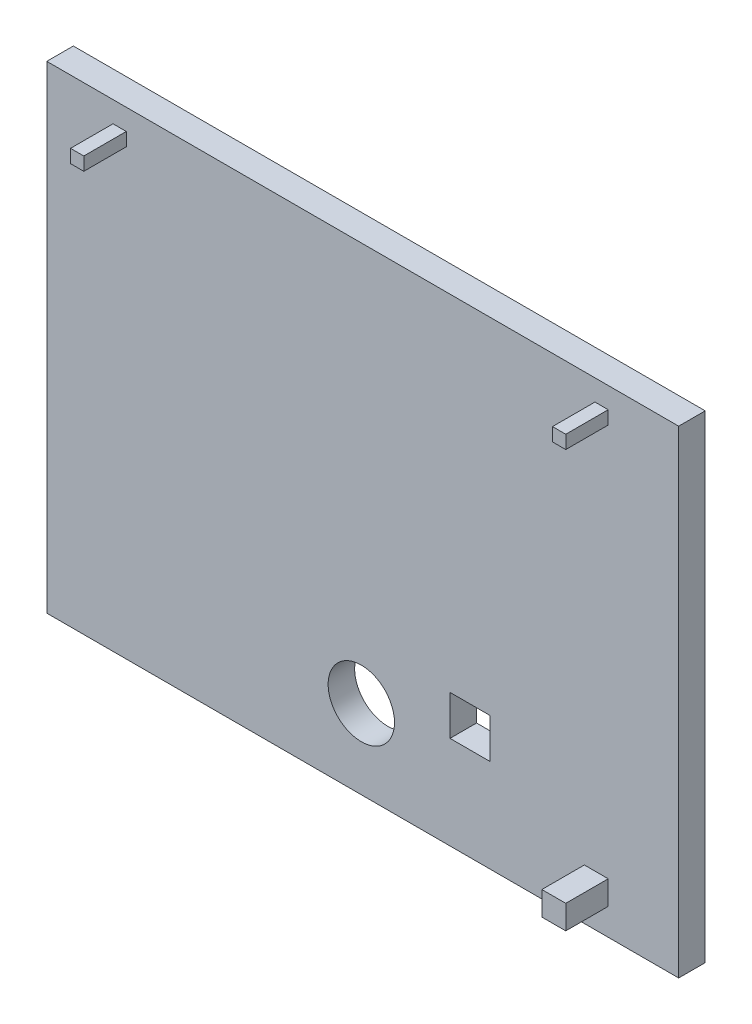
ISO-10303-21;
HEADER;
FILE_DESCRIPTION(('STEP AP214'),'2;1');
FILE_NAME('part.step','',(''),(''),'','','');
FILE_SCHEMA(('AUTOMOTIVE_DESIGN { 1 0 10303 214 1 1 1 1 }'));
ENDSEC;
DATA;
#1=APPLICATION_CONTEXT('core data for automotive mechanical design processes');
#2=APPLICATION_PROTOCOL_DEFINITION('international standard','automotive_design',2000,#1);
#3=PRODUCT_CONTEXT('',#1,'mechanical');
#4=PRODUCT('Part','Part','',(#3));
#5=PRODUCT_RELATED_PRODUCT_CATEGORY('part','',(#4));
#6=PRODUCT_DEFINITION_FORMATION('','',#4);
#7=PRODUCT_DEFINITION_CONTEXT('part definition',#1,'design');
#8=PRODUCT_DEFINITION('design','',#6,#7);
#9=PRODUCT_DEFINITION_SHAPE('','',#8);
#10=(LENGTH_UNIT() NAMED_UNIT(*) SI_UNIT(.MILLI.,.METRE.));
#11=(NAMED_UNIT(*) PLANE_ANGLE_UNIT() SI_UNIT($,.RADIAN.));
#12=(NAMED_UNIT(*) SI_UNIT($,.STERADIAN.) SOLID_ANGLE_UNIT());
#13=UNCERTAINTY_MEASURE_WITH_UNIT(LENGTH_MEASURE(1.E-05),#10,'distance_accuracy_value','');
#14=(GEOMETRIC_REPRESENTATION_CONTEXT(3) GLOBAL_UNCERTAINTY_ASSIGNED_CONTEXT((#13)) GLOBAL_UNIT_ASSIGNED_CONTEXT((#10,
#11,#12)) REPRESENTATION_CONTEXT('',''));
#15=CARTESIAN_POINT('',(0.,0.,0.));
#16=DIRECTION('',(0.,0.,1.));
#17=DIRECTION('',(1.,0.,0.));
#18=AXIS2_PLACEMENT_3D('',#15,#16,#17);
#19=CARTESIAN_POINT('',(0.,0.,5.));
#20=DIRECTION('',(0.,0.,1.));
#21=DIRECTION('',(1.,0.,0.));
#22=AXIS2_PLACEMENT_3D('',#19,#20,#21);
#23=PLANE('',#22);
#24=DIRECTION('',(0.,-1.,0.));
#25=VECTOR('',#24,1.);
#26=CARTESIAN_POINT('',(75.9499050291584,-2.34225925781849E-13,5.));
#27=LINE('',#26,#25);
#28=CARTESIAN_POINT('',(75.949905029158,-119.032846691838,5.));
#29=VERTEX_POINT('',#28);
#30=CARTESIAN_POINT('',(75.949905029158,-123.532846691838,5.));
#31=VERTEX_POINT('',#30);
#32=EDGE_CURVE('E348',#29,#31,#27,.T.);
#33=ORIENTED_EDGE('',*,*,#32,.F.);
#34=DIRECTION('',(1.,0.,0.));
#35=VECTOR('',#34,1.);
#36=CARTESIAN_POINT('',(0.,-119.032846691838,5.));
#37=LINE('',#36,#35);
#38=CARTESIAN_POINT('',(80.4499050291581,-119.032846691838,5.));
#39=VERTEX_POINT('',#38);
#40=EDGE_CURVE('E333',#29,#39,#37,.T.);
#41=ORIENTED_EDGE('',*,*,#40,.T.);
#42=DIRECTION('',(0.,-1.,0.));
#43=VECTOR('',#42,1.);
#44=CARTESIAN_POINT('',(80.4499050291581,0.,5.));
#45=LINE('',#44,#43);
#46=CARTESIAN_POINT('',(80.4499050291581,-123.532846691838,5.));
#47=VERTEX_POINT('',#46);
#48=EDGE_CURVE('E343',#39,#47,#45,.T.);
#49=ORIENTED_EDGE('',*,*,#48,.T.);
#50=DIRECTION('',(1.,0.,0.));
#51=VECTOR('',#50,1.);
#52=CARTESIAN_POINT('',(0.,-123.532846691838,5.));
#53=LINE('',#52,#51);
#54=EDGE_CURVE('E346',#31,#47,#53,.T.);
#55=ORIENTED_EDGE('',*,*,#54,.F.);
#56=EDGE_LOOP('',(#33,#41,#49,#55));
#57=FACE_BOUND('',#56,.T.);
#58=CARTESIAN_POINT('',(33.949905029158,-113.682846691838,5.));
#59=DIRECTION('',(0.,0.,1.));
#60=DIRECTION('',(1.,0.,0.));
#61=AXIS2_PLACEMENT_3D('',#58,#59,#60);
#62=CIRCLE('',#61,6.25000000000001);
#63=CARTESIAN_POINT('',(40.199905029158,-113.682846691838,5.));
#64=VERTEX_POINT('',#63);
#65=EDGE_CURVE('E271',#64,#64,#62,.T.);
#66=ORIENTED_EDGE('',*,*,#65,.F.);
#67=EDGE_LOOP('',(#66));
#68=FACE_BOUND('',#67,.T.);
#69=DIRECTION('',(1.,0.,0.));
#70=VECTOR('',#69,1.);
#71=CARTESIAN_POINT('',(0.,-103.532846691838,5.));
#72=LINE('',#71,#70);
#73=CARTESIAN_POINT('',(50.649905029158,-103.532846691838,5.));
#74=VERTEX_POINT('',#73);
#75=CARTESIAN_POINT('',(58.149905029158,-103.532846691838,5.));
#76=VERTEX_POINT('',#75);
#77=EDGE_CURVE('E274',#74,#76,#72,.T.);
#78=ORIENTED_EDGE('',*,*,#77,.T.);
#79=DIRECTION('',(0.,-1.,0.));
#80=VECTOR('',#79,1.);
#81=CARTESIAN_POINT('',(58.149905029158,0.,5.));
#82=LINE('',#81,#80);
#83=CARTESIAN_POINT('',(58.149905029158,-111.032846691838,5.));
#84=VERTEX_POINT('',#83);
#85=EDGE_CURVE('E278',#76,#84,#82,.T.);
#86=ORIENTED_EDGE('',*,*,#85,.T.);
#87=DIRECTION('',(1.,0.,0.));
#88=VECTOR('',#87,1.);
#89=CARTESIAN_POINT('',(0.,-111.032846691838,5.));
#90=LINE('',#89,#88);
#91=CARTESIAN_POINT('',(50.649905029158,-111.032846691838,5.));
#92=VERTEX_POINT('',#91);
#93=EDGE_CURVE('E280',#92,#84,#90,.T.);
#94=ORIENTED_EDGE('',*,*,#93,.F.);
#95=DIRECTION('',(0.,-1.,0.));
#96=VECTOR('',#95,1.);
#97=CARTESIAN_POINT('',(50.649905029158,0.,5.));
#98=LINE('',#97,#96);
#99=EDGE_CURVE('E283',#74,#92,#98,.T.);
#100=ORIENTED_EDGE('',*,*,#99,.F.);
#101=EDGE_LOOP('',(#78,#86,#94,#100));
#102=FACE_BOUND('',#101,.T.);
#103=DIRECTION('',(0.,-1.,0.));
#104=VECTOR('',#103,1.);
#105=CARTESIAN_POINT('',(93.714905029158,0.,5.));
#106=LINE('',#105,#104);
#107=CARTESIAN_POINT('',(93.714905029158,-38.5828466918378,5.));
#108=VERTEX_POINT('',#107);
#109=CARTESIAN_POINT('',(93.714905029158,-128.582846691838,5.));
#110=VERTEX_POINT('',#109);
#111=EDGE_CURVE('E286',#108,#110,#106,.T.);
#112=ORIENTED_EDGE('',*,*,#111,.F.);
#113=DIRECTION('',(1.,0.,0.));
#114=VECTOR('',#113,1.);
#115=CARTESIAN_POINT('',(0.,-38.5828466918377,5.));
#116=LINE('',#115,#114);
#117=CARTESIAN_POINT('',(-25.285094970842,-38.5828466918377,5.));
#118=VERTEX_POINT('',#117);
#119=EDGE_CURVE('E289',#118,#108,#116,.T.);
#120=ORIENTED_EDGE('',*,*,#119,.F.);
#121=DIRECTION('',(0.,-1.,0.));
#122=VECTOR('',#121,1.);
#123=CARTESIAN_POINT('',(-25.285094970842,0.,5.));
#124=LINE('',#123,#122);
#125=CARTESIAN_POINT('',(-25.2850949708419,-128.582846691838,5.));
#126=VERTEX_POINT('',#125);
#127=EDGE_CURVE('E292',#118,#126,#124,.T.);
#128=ORIENTED_EDGE('',*,*,#127,.T.);
#129=DIRECTION('',(1.,0.,0.));
#130=VECTOR('',#129,1.);
#131=CARTESIAN_POINT('',(0.,-128.582846691838,5.));
#132=LINE('',#131,#130);
#133=EDGE_CURVE('E295',#126,#110,#132,.T.);
#134=ORIENTED_EDGE('',*,*,#133,.T.);
#135=EDGE_LOOP('',(#112,#120,#128,#134));
#136=FACE_BOUND('',#135,.T.);
#137=DIRECTION('',(-1.,0.,0.));
#138=VECTOR('',#137,1.);
#139=CARTESIAN_POINT('',(0.,-45.0328466918377,5.));
#140=LINE('',#139,#138);
#141=CARTESIAN_POINT('',(-10.310094970842,-45.0328466918377,5.));
#142=VERTEX_POINT('',#141);
#143=CARTESIAN_POINT('',(-12.810094970842,-45.0328466918377,5.));
#144=VERTEX_POINT('',#143);
#145=EDGE_CURVE('E66',#142,#144,#140,.T.);
#146=ORIENTED_EDGE('',*,*,#145,.T.);
#147=DIRECTION('',(0.,1.,0.));
#148=VECTOR('',#147,1.);
#149=CARTESIAN_POINT('',(-12.8100949708419,0.,5.));
#150=LINE('',#149,#148);
#151=CARTESIAN_POINT('',(-12.810094970842,-42.5328466918377,5.));
#152=VERTEX_POINT('',#151);
#153=EDGE_CURVE('E12',#144,#152,#150,.T.);
#154=ORIENTED_EDGE('',*,*,#153,.T.);
#155=DIRECTION('',(-1.,0.,0.));
#156=VECTOR('',#155,1.);
#157=CARTESIAN_POINT('',(0.,-42.5328466918377,5.));
#158=LINE('',#157,#156);
#159=CARTESIAN_POINT('',(-10.310094970842,-42.5328466918377,5.));
#160=VERTEX_POINT('',#159);
#161=EDGE_CURVE('E350',#160,#152,#158,.T.);
#162=ORIENTED_EDGE('',*,*,#161,.F.);
#163=DIRECTION('',(0.,1.,0.));
#164=VECTOR('',#163,1.);
#165=CARTESIAN_POINT('',(-10.310094970842,0.,5.));
#166=LINE('',#165,#164);
#167=EDGE_CURVE('E353',#142,#160,#166,.T.);
#168=ORIENTED_EDGE('',*,*,#167,.F.);
#169=EDGE_LOOP('',(#146,#154,#162,#168));
#170=FACE_BOUND('',#169,.T.);
#171=DIRECTION('',(-1.,0.,0.));
#172=VECTOR('',#171,1.);
#173=CARTESIAN_POINT('',(0.,-45.0328466918377,5.));
#174=LINE('',#173,#172);
#175=CARTESIAN_POINT('',(80.449905029158,-45.0328466918377,5.));
#176=VERTEX_POINT('',#175);
#177=CARTESIAN_POINT('',(77.949905029158,-45.0328466918377,5.));
#178=VERTEX_POINT('',#177);
#179=EDGE_CURVE('E73',#176,#178,#174,.T.);
#180=ORIENTED_EDGE('',*,*,#179,.T.);
#181=DIRECTION('',(0.,1.,0.));
#182=VECTOR('',#181,1.);
#183=CARTESIAN_POINT('',(77.949905029158,0.,5.));
#184=LINE('',#183,#182);
#185=CARTESIAN_POINT('',(77.949905029158,-42.5328466918377,5.));
#186=VERTEX_POINT('',#185);
#187=EDGE_CURVE('E224',#178,#186,#184,.T.);
#188=ORIENTED_EDGE('',*,*,#187,.T.);
#189=DIRECTION('',(-1.,0.,0.));
#190=VECTOR('',#189,1.);
#191=CARTESIAN_POINT('',(-1.18052364250325E-13,-42.5328466918375,5.));
#192=LINE('',#191,#190);
#193=CARTESIAN_POINT('',(80.4499050291581,-42.5328466918377,5.));
#194=VERTEX_POINT('',#193);
#195=EDGE_CURVE('E199',#194,#186,#192,.T.);
#196=ORIENTED_EDGE('',*,*,#195,.F.);
#197=DIRECTION('',(0.,1.,0.));
#198=VECTOR('',#197,1.);
#199=CARTESIAN_POINT('',(80.4499050291583,-4.46586684461394E-13,5.));
#200=LINE('',#199,#198);
#201=EDGE_CURVE('E78',#176,#194,#200,.T.);
#202=ORIENTED_EDGE('',*,*,#201,.F.);
#203=EDGE_LOOP('',(#180,#188,#196,#202));
#204=FACE_BOUND('',#203,.T.);
#205=ADVANCED_FACE('F58',(#57,#68,#102,#136,#170,#204),#23,.T.);
#206=CARTESIAN_POINT('',(0.,-38.5828466918377,5.));
#207=DIRECTION('',(0.,1.,0.));
#208=DIRECTION('',(-1.,0.,0.));
#209=AXIS2_PLACEMENT_3D('',#206,#207,#208);
#210=PLANE('',#209);
#211=DIRECTION('',(1.,0.,0.));
#212=VECTOR('',#211,1.);
#213=CARTESIAN_POINT('',(0.,-38.5828466918377,0.));
#214=LINE('',#213,#212);
#215=CARTESIAN_POINT('',(-25.285094970842,-38.5828466918377,0.));
#216=VERTEX_POINT('',#215);
#217=CARTESIAN_POINT('',(93.714905029158,-38.5828466918378,0.));
#218=VERTEX_POINT('',#217);
#219=EDGE_CURVE('E315',#216,#218,#214,.T.);
#220=ORIENTED_EDGE('',*,*,#219,.F.);
#221=DIRECTION('',(0.,0.,-1.));
#222=VECTOR('',#221,1.);
#223=CARTESIAN_POINT('',(-25.285094970842,-38.5828466918377,5.));
#224=LINE('',#223,#222);
#225=EDGE_CURVE('E329',#118,#216,#224,.T.);
#226=ORIENTED_EDGE('',*,*,#225,.F.);
#227=ORIENTED_EDGE('',*,*,#119,.T.);
#228=DIRECTION('',(0.,0.,-1.));
#229=VECTOR('',#228,1.);
#230=CARTESIAN_POINT('',(93.714905029158,-38.5828466918378,5.));
#231=LINE('',#230,#229);
#232=EDGE_CURVE('E331',#108,#218,#231,.T.);
#233=ORIENTED_EDGE('',*,*,#232,.T.);
#234=EDGE_LOOP('',(#220,#226,#227,#233));
#235=FACE_BOUND('',#234,.T.);
#236=ADVANCED_FACE('F382',(#235),#210,.T.);
#237=CARTESIAN_POINT('',(-25.285094970842,0.,5.));
#238=DIRECTION('',(1.,0.,0.));
#239=DIRECTION('',(0.,1.,0.));
#240=AXIS2_PLACEMENT_3D('',#237,#238,#239);
#241=PLANE('',#240);
#242=DIRECTION('',(0.,-1.,0.));
#243=VECTOR('',#242,1.);
#244=CARTESIAN_POINT('',(-25.285094970842,0.,0.));
#245=LINE('',#244,#243);
#246=CARTESIAN_POINT('',(-25.2850949708419,-128.582846691838,0.));
#247=VERTEX_POINT('',#246);
#248=EDGE_CURVE('E318',#216,#247,#245,.T.);
#249=ORIENTED_EDGE('',*,*,#248,.T.);
#250=DIRECTION('',(0.,0.,-1.));
#251=VECTOR('',#250,1.);
#252=CARTESIAN_POINT('',(-25.2850949708419,-128.582846691838,5.));
#253=LINE('',#252,#251);
#254=EDGE_CURVE('E325',#126,#247,#253,.T.);
#255=ORIENTED_EDGE('',*,*,#254,.F.);
#256=ORIENTED_EDGE('',*,*,#127,.F.);
#257=ORIENTED_EDGE('',*,*,#225,.T.);
#258=EDGE_LOOP('',(#249,#255,#256,#257));
#259=FACE_BOUND('',#258,.T.);
#260=ADVANCED_FACE('F388',(#259),#241,.F.);
#261=CARTESIAN_POINT('',(0.,-128.582846691838,5.));
#262=DIRECTION('',(0.,1.,0.));
#263=DIRECTION('',(0.,0.,1.));
#264=AXIS2_PLACEMENT_3D('',#261,#262,#263);
#265=PLANE('',#264);
#266=DIRECTION('',(1.,0.,0.));
#267=VECTOR('',#266,1.);
#268=CARTESIAN_POINT('',(0.,-128.582846691838,0.));
#269=LINE('',#268,#267);
#270=CARTESIAN_POINT('',(93.714905029158,-128.582846691838,0.));
#271=VERTEX_POINT('',#270);
#272=EDGE_CURVE('E275',#247,#271,#269,.T.);
#273=ORIENTED_EDGE('',*,*,#272,.T.);
#274=DIRECTION('',(0.,0.,-1.));
#275=VECTOR('',#274,1.);
#276=CARTESIAN_POINT('',(93.714905029158,-128.582846691838,5.));
#277=LINE('',#276,#275);
#278=EDGE_CURVE('E323',#110,#271,#277,.T.);
#279=ORIENTED_EDGE('',*,*,#278,.F.);
#280=ORIENTED_EDGE('',*,*,#133,.F.);
#281=ORIENTED_EDGE('',*,*,#254,.T.);
#282=EDGE_LOOP('',(#273,#279,#280,#281));
#283=FACE_BOUND('',#282,.T.);
#284=ADVANCED_FACE('F401',(#283),#265,.F.);
#285=CARTESIAN_POINT('',(93.714905029158,0.,5.));
#286=DIRECTION('',(1.,0.,0.));
#287=DIRECTION('',(0.,0.,-1.));
#288=AXIS2_PLACEMENT_3D('',#285,#286,#287);
#289=PLANE('',#288);
#290=DIRECTION('',(0.,-1.,0.));
#291=VECTOR('',#290,1.);
#292=CARTESIAN_POINT('',(93.714905029158,0.,0.));
#293=LINE('',#292,#291);
#294=EDGE_CURVE('E312',#218,#271,#293,.T.);
#295=ORIENTED_EDGE('',*,*,#294,.F.);
#296=ORIENTED_EDGE('',*,*,#232,.F.);
#297=ORIENTED_EDGE('',*,*,#111,.T.);
#298=ORIENTED_EDGE('',*,*,#278,.T.);
#299=EDGE_LOOP('',(#295,#296,#297,#298));
#300=FACE_BOUND('',#299,.T.);
#301=ADVANCED_FACE('F404',(#300),#289,.T.);
#302=CARTESIAN_POINT('',(58.149905029158,0.,5.));
#303=DIRECTION('',(1.,0.,0.));
#304=DIRECTION('',(0.,0.,-1.));
#305=AXIS2_PLACEMENT_3D('',#302,#303,#304);
#306=PLANE('',#305);
#307=DIRECTION('',(0.,-1.,0.));
#308=VECTOR('',#307,1.);
#309=CARTESIAN_POINT('',(58.149905029158,0.,0.));
#310=LINE('',#309,#308);
#311=CARTESIAN_POINT('',(58.149905029158,-103.532846691838,0.));
#312=VERTEX_POINT('',#311);
#313=CARTESIAN_POINT('',(58.149905029158,-111.032846691838,0.));
#314=VERTEX_POINT('',#313);
#315=EDGE_CURVE('E303',#312,#314,#310,.T.);
#316=ORIENTED_EDGE('',*,*,#315,.T.);
#317=DIRECTION('',(0.,0.,-1.));
#318=VECTOR('',#317,1.);
#319=CARTESIAN_POINT('',(58.149905029158,-111.032846691838,5.));
#320=LINE('',#319,#318);
#321=EDGE_CURVE('E337',#84,#314,#320,.T.);
#322=ORIENTED_EDGE('',*,*,#321,.F.);
#323=ORIENTED_EDGE('',*,*,#85,.F.);
#324=DIRECTION('',(0.,0.,-1.));
#325=VECTOR('',#324,1.);
#326=CARTESIAN_POINT('',(58.149905029158,-103.532846691838,5.));
#327=LINE('',#326,#325);
#328=EDGE_CURVE('E326',#76,#312,#327,.T.);
#329=ORIENTED_EDGE('',*,*,#328,.T.);
#330=EDGE_LOOP('',(#316,#322,#323,#329));
#331=FACE_BOUND('',#330,.T.);
#332=ADVANCED_FACE('F411',(#331),#306,.F.);
#333=CARTESIAN_POINT('',(0.,-111.032846691838,5.));
#334=DIRECTION('',(0.,1.,0.));
#335=DIRECTION('',(0.,0.,1.));
#336=AXIS2_PLACEMENT_3D('',#333,#334,#335);
#337=PLANE('',#336);
#338=DIRECTION('',(1.,0.,0.));
#339=VECTOR('',#338,1.);
#340=CARTESIAN_POINT('',(0.,-111.032846691838,0.));
#341=LINE('',#340,#339);
#342=CARTESIAN_POINT('',(50.649905029158,-111.032846691838,0.));
#343=VERTEX_POINT('',#342);
#344=EDGE_CURVE('E306',#343,#314,#341,.T.);
#345=ORIENTED_EDGE('',*,*,#344,.F.);
#346=DIRECTION('',(0.,0.,-1.));
#347=VECTOR('',#346,1.);
#348=CARTESIAN_POINT('',(50.649905029158,-111.032846691838,5.));
#349=LINE('',#348,#347);
#350=EDGE_CURVE('E335',#92,#343,#349,.T.);
#351=ORIENTED_EDGE('',*,*,#350,.F.);
#352=ORIENTED_EDGE('',*,*,#93,.T.);
#353=ORIENTED_EDGE('',*,*,#321,.T.);
#354=EDGE_LOOP('',(#345,#351,#352,#353));
#355=FACE_BOUND('',#354,.T.);
#356=ADVANCED_FACE('F417',(#355),#337,.T.);
#357=CARTESIAN_POINT('',(50.649905029158,0.,5.));
#358=DIRECTION('',(1.,0.,0.));
#359=DIRECTION('',(0.,0.,-1.));
#360=AXIS2_PLACEMENT_3D('',#357,#358,#359);
#361=PLANE('',#360);
#362=DIRECTION('',(0.,-1.,0.));
#363=VECTOR('',#362,1.);
#364=CARTESIAN_POINT('',(50.649905029158,0.,0.));
#365=LINE('',#364,#363);
#366=CARTESIAN_POINT('',(50.649905029158,-103.532846691838,0.));
#367=VERTEX_POINT('',#366);
#368=EDGE_CURVE('E309',#367,#343,#365,.T.);
#369=ORIENTED_EDGE('',*,*,#368,.F.);
#370=DIRECTION('',(0.,0.,-1.));
#371=VECTOR('',#370,1.);
#372=CARTESIAN_POINT('',(50.649905029158,-103.532846691838,5.));
#373=LINE('',#372,#371);
#374=EDGE_CURVE('E297',#74,#367,#373,.T.);
#375=ORIENTED_EDGE('',*,*,#374,.F.);
#376=ORIENTED_EDGE('',*,*,#99,.T.);
#377=ORIENTED_EDGE('',*,*,#350,.T.);
#378=EDGE_LOOP('',(#369,#375,#376,#377));
#379=FACE_BOUND('',#378,.T.);
#380=ADVANCED_FACE('F413',(#379),#361,.T.);
#381=CARTESIAN_POINT('',(0.,-103.532846691838,5.));
#382=DIRECTION('',(0.,1.,0.));
#383=DIRECTION('',(0.,0.,1.));
#384=AXIS2_PLACEMENT_3D('',#381,#382,#383);
#385=PLANE('',#384);
#386=DIRECTION('',(1.,0.,0.));
#387=VECTOR('',#386,1.);
#388=CARTESIAN_POINT('',(0.,-103.532846691838,0.));
#389=LINE('',#388,#387);
#390=EDGE_CURVE('E300',#367,#312,#389,.T.);
#391=ORIENTED_EDGE('',*,*,#390,.T.);
#392=ORIENTED_EDGE('',*,*,#328,.F.);
#393=ORIENTED_EDGE('',*,*,#77,.F.);
#394=ORIENTED_EDGE('',*,*,#374,.T.);
#395=EDGE_LOOP('',(#391,#392,#393,#394));
#396=FACE_BOUND('',#395,.T.);
#397=ADVANCED_FACE('F416',(#396),#385,.F.);
#398=CARTESIAN_POINT('',(33.949905029158,-113.682846691838,5.));
#399=DIRECTION('',(0.,0.,-1.));
#400=DIRECTION('',(-1.,0.,0.));
#401=AXIS2_PLACEMENT_3D('',#398,#399,#400);
#402=CYLINDRICAL_SURFACE('',#401,6.25000000000001);
#403=ORIENTED_EDGE('',*,*,#65,.T.);
#404=EDGE_LOOP('',(#403));
#405=FACE_BOUND('',#404,.T.);
#406=CARTESIAN_POINT('',(33.949905029158,-113.682846691838,0.));
#407=DIRECTION('',(0.,0.,1.));
#408=DIRECTION('',(1.,0.,0.));
#409=AXIS2_PLACEMENT_3D('',#406,#407,#408);
#410=CIRCLE('',#409,6.25000000000001);
#411=CARTESIAN_POINT('',(40.199905029158,-113.682846691838,0.));
#412=VERTEX_POINT('',#411);
#413=EDGE_CURVE('E270',#412,#412,#410,.T.);
#414=ORIENTED_EDGE('',*,*,#413,.F.);
#415=EDGE_LOOP('',(#414));
#416=FACE_BOUND('',#415,.T.);
#417=ADVANCED_FACE('F60',(#405,#416),#402,.F.);
#418=CARTESIAN_POINT('',(0.,0.,0.));
#419=DIRECTION('',(0.,0.,1.));
#420=DIRECTION('',(1.,0.,0.));
#421=AXIS2_PLACEMENT_3D('',#418,#419,#420);
#422=PLANE('',#421);
#423=ORIENTED_EDGE('',*,*,#413,.T.);
#424=EDGE_LOOP('',(#423));
#425=FACE_BOUND('',#424,.T.);
#426=ORIENTED_EDGE('',*,*,#390,.F.);
#427=ORIENTED_EDGE('',*,*,#368,.T.);
#428=ORIENTED_EDGE('',*,*,#344,.T.);
#429=ORIENTED_EDGE('',*,*,#315,.F.);
#430=EDGE_LOOP('',(#426,#427,#428,#429));
#431=FACE_BOUND('',#430,.T.);
#432=ORIENTED_EDGE('',*,*,#294,.T.);
#433=ORIENTED_EDGE('',*,*,#272,.F.);
#434=ORIENTED_EDGE('',*,*,#248,.F.);
#435=ORIENTED_EDGE('',*,*,#219,.T.);
#436=EDGE_LOOP('',(#432,#433,#434,#435));
#437=FACE_BOUND('',#436,.T.);
#438=ADVANCED_FACE('F397',(#425,#431,#437),#422,.F.);
#439=CARTESIAN_POINT('',(75.9499050291584,-2.34225925781849E-13,13.));
#440=DIRECTION('',(-1.,0.,0.));
#441=DIRECTION('',(0.,-1.,0.));
#442=AXIS2_PLACEMENT_3D('',#439,#440,#441);
#443=PLANE('',#442);
#444=DIRECTION('',(0.,0.,-1.));
#445=VECTOR('',#444,1.);
#446=CARTESIAN_POINT('',(75.949905029158,-119.032846691838,13.));
#447=LINE('',#446,#445);
#448=CARTESIAN_POINT('',(75.949905029158,-119.032846691838,13.));
#449=VERTEX_POINT('',#448);
#450=EDGE_CURVE('E259',#449,#29,#447,.T.);
#451=ORIENTED_EDGE('',*,*,#450,.T.);
#452=ORIENTED_EDGE('',*,*,#32,.T.);
#453=DIRECTION('',(0.,0.,-1.));
#454=VECTOR('',#453,1.);
#455=CARTESIAN_POINT('',(75.949905029158,-123.532846691838,13.));
#456=LINE('',#455,#454);
#457=CARTESIAN_POINT('',(75.949905029158,-123.532846691838,13.));
#458=VERTEX_POINT('',#457);
#459=EDGE_CURVE('E267',#458,#31,#456,.T.);
#460=ORIENTED_EDGE('',*,*,#459,.F.);
#461=DIRECTION('',(0.,1.,0.));
#462=VECTOR('',#461,1.);
#463=CARTESIAN_POINT('',(75.9499050291584,-2.34225925781849E-13,13.));
#464=LINE('',#463,#462);
#465=EDGE_CURVE('E249',#458,#449,#464,.T.);
#466=ORIENTED_EDGE('',*,*,#465,.T.);
#467=EDGE_LOOP('',(#451,#452,#460,#466));
#468=FACE_BOUND('',#467,.T.);
#469=ADVANCED_FACE('F395',(#468),#443,.T.);
#470=CARTESIAN_POINT('',(0.,-123.532846691838,13.));
#471=DIRECTION('',(0.,-1.,0.));
#472=DIRECTION('',(0.,0.,-1.));
#473=AXIS2_PLACEMENT_3D('',#470,#471,#472);
#474=PLANE('',#473);
#475=ORIENTED_EDGE('',*,*,#459,.T.);
#476=ORIENTED_EDGE('',*,*,#54,.T.);
#477=DIRECTION('',(0.,0.,-1.));
#478=VECTOR('',#477,1.);
#479=CARTESIAN_POINT('',(80.4499050291581,-123.532846691838,13.));
#480=LINE('',#479,#478);
#481=CARTESIAN_POINT('',(80.4499050291581,-123.532846691838,13.));
#482=VERTEX_POINT('',#481);
#483=EDGE_CURVE('E264',#482,#47,#480,.T.);
#484=ORIENTED_EDGE('',*,*,#483,.F.);
#485=DIRECTION('',(-1.,0.,0.));
#486=VECTOR('',#485,1.);
#487=CARTESIAN_POINT('',(0.,-123.532846691838,13.));
#488=LINE('',#487,#486);
#489=EDGE_CURVE('E252',#482,#458,#488,.T.);
#490=ORIENTED_EDGE('',*,*,#489,.T.);
#491=EDGE_LOOP('',(#475,#476,#484,#490));
#492=FACE_BOUND('',#491,.T.);
#493=ADVANCED_FACE('F465',(#492),#474,.T.);
#494=CARTESIAN_POINT('',(80.4499050291581,0.,13.));
#495=DIRECTION('',(-1.,0.,0.));
#496=DIRECTION('',(0.,0.,1.));
#497=AXIS2_PLACEMENT_3D('',#494,#495,#496);
#498=PLANE('',#497);
#499=ORIENTED_EDGE('',*,*,#48,.F.);
#500=DIRECTION('',(0.,0.,-1.));
#501=VECTOR('',#500,1.);
#502=CARTESIAN_POINT('',(80.4499050291581,-119.032846691838,13.));
#503=LINE('',#502,#501);
#504=CARTESIAN_POINT('',(80.4499050291581,-119.032846691838,13.));
#505=VERTEX_POINT('',#504);
#506=EDGE_CURVE('E262',#505,#39,#503,.T.);
#507=ORIENTED_EDGE('',*,*,#506,.F.);
#508=DIRECTION('',(0.,1.,0.));
#509=VECTOR('',#508,1.);
#510=CARTESIAN_POINT('',(80.4499050291581,0.,13.));
#511=LINE('',#510,#509);
#512=EDGE_CURVE('E255',#482,#505,#511,.T.);
#513=ORIENTED_EDGE('',*,*,#512,.F.);
#514=ORIENTED_EDGE('',*,*,#483,.T.);
#515=EDGE_LOOP('',(#499,#507,#513,#514));
#516=FACE_BOUND('',#515,.T.);
#517=ADVANCED_FACE('F472',(#516),#498,.F.);
#518=CARTESIAN_POINT('',(0.,-119.032846691838,13.));
#519=DIRECTION('',(0.,-1.,0.));
#520=DIRECTION('',(0.,0.,-1.));
#521=AXIS2_PLACEMENT_3D('',#518,#519,#520);
#522=PLANE('',#521);
#523=ORIENTED_EDGE('',*,*,#40,.F.);
#524=ORIENTED_EDGE('',*,*,#450,.F.);
#525=DIRECTION('',(-1.,0.,0.));
#526=VECTOR('',#525,1.);
#527=CARTESIAN_POINT('',(0.,-119.032846691838,13.));
#528=LINE('',#527,#526);
#529=EDGE_CURVE('E257',#505,#449,#528,.T.);
#530=ORIENTED_EDGE('',*,*,#529,.F.);
#531=ORIENTED_EDGE('',*,*,#506,.T.);
#532=EDGE_LOOP('',(#523,#524,#530,#531));
#533=FACE_BOUND('',#532,.T.);
#534=ADVANCED_FACE('F479',(#533),#522,.F.);
#535=CARTESIAN_POINT('',(0.,0.,13.));
#536=DIRECTION('',(0.,0.,1.));
#537=DIRECTION('',(1.,0.,0.));
#538=AXIS2_PLACEMENT_3D('',#535,#536,#537);
#539=PLANE('',#538);
#540=ORIENTED_EDGE('',*,*,#465,.F.);
#541=ORIENTED_EDGE('',*,*,#489,.F.);
#542=ORIENTED_EDGE('',*,*,#512,.T.);
#543=ORIENTED_EDGE('',*,*,#529,.T.);
#544=EDGE_LOOP('',(#540,#541,#542,#543));
#545=FACE_BOUND('',#544,.T.);
#546=ADVANCED_FACE('F487',(#545),#539,.T.);
#547=CARTESIAN_POINT('',(-12.810094970842,-42.5328466918377,13.));
#548=DIRECTION('',(1.,0.,0.));
#549=DIRECTION('',(0.,1.,0.));
#550=AXIS2_PLACEMENT_3D('',#547,#548,#549);
#551=PLANE('',#550);
#552=ORIENTED_EDGE('',*,*,#153,.F.);
#553=DIRECTION('',(0.,0.,-1.));
#554=VECTOR('',#553,1.);
#555=CARTESIAN_POINT('',(-12.810094970842,-45.0328466918377,13.));
#556=LINE('',#555,#554);
#557=CARTESIAN_POINT('',(-12.810094970842,-45.0328466918377,13.));
#558=VERTEX_POINT('',#557);
#559=EDGE_CURVE('E226',#558,#144,#556,.T.);
#560=ORIENTED_EDGE('',*,*,#559,.F.);
#561=DIRECTION('',(0.,-1.,0.));
#562=VECTOR('',#561,1.);
#563=CARTESIAN_POINT('',(-12.810094970842,-42.5328466918377,13.));
#564=LINE('',#563,#562);
#565=CARTESIAN_POINT('',(-12.810094970842,-42.5328466918377,13.));
#566=VERTEX_POINT('',#565);
#567=EDGE_CURVE('E246',#566,#558,#564,.T.);
#568=ORIENTED_EDGE('',*,*,#567,.F.);
#569=DIRECTION('',(0.,0.,-1.));
#570=VECTOR('',#569,1.);
#571=CARTESIAN_POINT('',(-12.810094970842,-42.5328466918377,13.));
#572=LINE('',#571,#570);
#573=EDGE_CURVE('E235',#566,#152,#572,.T.);
#574=ORIENTED_EDGE('',*,*,#573,.T.);
#575=EDGE_LOOP('',(#552,#560,#568,#574));
#576=FACE_BOUND('',#575,.T.);
#577=ADVANCED_FACE('F362',(#576),#551,.F.);
#578=CARTESIAN_POINT('',(-12.810094970842,-45.0328466918377,13.));
#579=DIRECTION('',(0.,1.,0.));
#580=DIRECTION('',(0.,0.,1.));
#581=AXIS2_PLACEMENT_3D('',#578,#579,#580);
#582=PLANE('',#581);
#583=ORIENTED_EDGE('',*,*,#145,.F.);
#584=DIRECTION('',(0.,0.,-1.));
#585=VECTOR('',#584,1.);
#586=CARTESIAN_POINT('',(-10.310094970842,-45.0328466918377,13.));
#587=LINE('',#586,#585);
#588=CARTESIAN_POINT('',(-10.310094970842,-45.0328466918377,13.));
#589=VERTEX_POINT('',#588);
#590=EDGE_CURVE('E229',#589,#142,#587,.T.);
#591=ORIENTED_EDGE('',*,*,#590,.F.);
#592=DIRECTION('',(1.,0.,0.));
#593=VECTOR('',#592,1.);
#594=CARTESIAN_POINT('',(-12.810094970842,-45.0328466918377,13.));
#595=LINE('',#594,#593);
#596=EDGE_CURVE('E244',#558,#589,#595,.T.);
#597=ORIENTED_EDGE('',*,*,#596,.F.);
#598=ORIENTED_EDGE('',*,*,#559,.T.);
#599=EDGE_LOOP('',(#583,#591,#597,#598));
#600=FACE_BOUND('',#599,.T.);
#601=ADVANCED_FACE('F364',(#600),#582,.F.);
#602=CARTESIAN_POINT('',(-10.310094970842,-42.5328466918377,13.));
#603=DIRECTION('',(1.,0.,0.));
#604=DIRECTION('',(0.,1.,0.));
#605=AXIS2_PLACEMENT_3D('',#602,#603,#604);
#606=PLANE('',#605);
#607=ORIENTED_EDGE('',*,*,#590,.T.);
#608=ORIENTED_EDGE('',*,*,#167,.T.);
#609=DIRECTION('',(0.,0.,-1.));
#610=VECTOR('',#609,1.);
#611=CARTESIAN_POINT('',(-10.310094970842,-42.5328466918377,13.));
#612=LINE('',#611,#610);
#613=CARTESIAN_POINT('',(-10.310094970842,-42.5328466918377,13.));
#614=VERTEX_POINT('',#613);
#615=EDGE_CURVE('E232',#614,#160,#612,.T.);
#616=ORIENTED_EDGE('',*,*,#615,.F.);
#617=DIRECTION('',(0.,-1.,0.));
#618=VECTOR('',#617,1.);
#619=CARTESIAN_POINT('',(-10.310094970842,-42.5328466918377,13.));
#620=LINE('',#619,#618);
#621=EDGE_CURVE('E241',#614,#589,#620,.T.);
#622=ORIENTED_EDGE('',*,*,#621,.T.);
#623=EDGE_LOOP('',(#607,#608,#616,#622));
#624=FACE_BOUND('',#623,.T.);
#625=ADVANCED_FACE('F372',(#624),#606,.T.);
#626=CARTESIAN_POINT('',(-12.810094970842,-42.5328466918377,13.));
#627=DIRECTION('',(0.,1.,0.));
#628=DIRECTION('',(0.,0.,1.));
#629=AXIS2_PLACEMENT_3D('',#626,#627,#628);
#630=PLANE('',#629);
#631=ORIENTED_EDGE('',*,*,#615,.T.);
#632=ORIENTED_EDGE('',*,*,#161,.T.);
#633=ORIENTED_EDGE('',*,*,#573,.F.);
#634=DIRECTION('',(1.,0.,0.));
#635=VECTOR('',#634,1.);
#636=CARTESIAN_POINT('',(-12.810094970842,-42.5328466918377,13.));
#637=LINE('',#636,#635);
#638=EDGE_CURVE('E238',#566,#614,#637,.T.);
#639=ORIENTED_EDGE('',*,*,#638,.T.);
#640=EDGE_LOOP('',(#631,#632,#633,#639));
#641=FACE_BOUND('',#640,.T.);
#642=ADVANCED_FACE('F370',(#641),#630,.T.);
#643=CARTESIAN_POINT('',(0.,0.,13.));
#644=DIRECTION('',(0.,0.,1.));
#645=DIRECTION('',(1.,0.,0.));
#646=AXIS2_PLACEMENT_3D('',#643,#644,#645);
#647=PLANE('',#646);
#648=ORIENTED_EDGE('',*,*,#567,.T.);
#649=ORIENTED_EDGE('',*,*,#596,.T.);
#650=ORIENTED_EDGE('',*,*,#621,.F.);
#651=ORIENTED_EDGE('',*,*,#638,.F.);
#652=EDGE_LOOP('',(#648,#649,#650,#651));
#653=FACE_BOUND('',#652,.T.);
#654=ADVANCED_FACE('F368',(#653),#647,.T.);
#655=CARTESIAN_POINT('',(77.949905029158,-42.5328466918377,13.));
#656=DIRECTION('',(1.,0.,0.));
#657=DIRECTION('',(0.,0.,-1.));
#658=AXIS2_PLACEMENT_3D('',#655,#656,#657);
#659=PLANE('',#658);
#660=ORIENTED_EDGE('',*,*,#187,.F.);
#661=DIRECTION('',(0.,0.,-1.));
#662=VECTOR('',#661,1.);
#663=CARTESIAN_POINT('',(77.949905029158,-45.0328466918377,13.));
#664=LINE('',#663,#662);
#665=CARTESIAN_POINT('',(77.949905029158,-45.0328466918377,13.));
#666=VERTEX_POINT('',#665);
#667=EDGE_CURVE('E208',#666,#178,#664,.T.);
#668=ORIENTED_EDGE('',*,*,#667,.F.);
#669=DIRECTION('',(0.,-1.,0.));
#670=VECTOR('',#669,1.);
#671=CARTESIAN_POINT('',(77.949905029158,-42.5328466918377,13.));
#672=LINE('',#671,#670);
#673=CARTESIAN_POINT('',(77.949905029158,-42.5328466918377,13.));
#674=VERTEX_POINT('',#673);
#675=EDGE_CURVE('E205',#674,#666,#672,.T.);
#676=ORIENTED_EDGE('',*,*,#675,.F.);
#677=DIRECTION('',(0.,0.,-1.));
#678=VECTOR('',#677,1.);
#679=CARTESIAN_POINT('',(77.949905029158,-42.5328466918377,13.));
#680=LINE('',#679,#678);
#681=EDGE_CURVE('E193',#674,#186,#680,.T.);
#682=ORIENTED_EDGE('',*,*,#681,.T.);
#683=EDGE_LOOP('',(#660,#668,#676,#682));
#684=FACE_BOUND('',#683,.T.);
#685=ADVANCED_FACE('F206',(#684),#659,.F.);
#686=CARTESIAN_POINT('',(77.949905029158,-45.0328466918377,13.));
#687=DIRECTION('',(0.,1.,0.));
#688=DIRECTION('',(0.,0.,1.));
#689=AXIS2_PLACEMENT_3D('',#686,#687,#688);
#690=PLANE('',#689);
#691=ORIENTED_EDGE('',*,*,#179,.F.);
#692=DIRECTION('',(0.,0.,-1.));
#693=VECTOR('',#692,1.);
#694=CARTESIAN_POINT('',(80.449905029158,-45.0328466918377,13.));
#695=LINE('',#694,#693);
#696=CARTESIAN_POINT('',(80.449905029158,-45.0328466918377,13.));
#697=VERTEX_POINT('',#696);
#698=EDGE_CURVE('E574',#697,#176,#695,.T.);
#699=ORIENTED_EDGE('',*,*,#698,.F.);
#700=DIRECTION('',(1.,0.,0.));
#701=VECTOR('',#700,1.);
#702=CARTESIAN_POINT('',(77.949905029158,-45.0328466918377,13.));
#703=LINE('',#702,#701);
#704=EDGE_CURVE('E210',#666,#697,#703,.T.);
#705=ORIENTED_EDGE('',*,*,#704,.F.);
#706=ORIENTED_EDGE('',*,*,#667,.T.);
#707=EDGE_LOOP('',(#691,#699,#705,#706));
#708=FACE_BOUND('',#707,.T.);
#709=ADVANCED_FACE('F533',(#708),#690,.F.);
#710=CARTESIAN_POINT('',(80.4499050291581,-42.5328466918377,13.));
#711=DIRECTION('',(1.,0.,0.));
#712=DIRECTION('',(0.,1.,0.));
#713=AXIS2_PLACEMENT_3D('',#710,#711,#712);
#714=PLANE('',#713);
#715=ORIENTED_EDGE('',*,*,#698,.T.);
#716=ORIENTED_EDGE('',*,*,#201,.T.);
#717=DIRECTION('',(0.,0.,-1.));
#718=VECTOR('',#717,1.);
#719=CARTESIAN_POINT('',(80.4499050291581,-42.5328466918377,13.));
#720=LINE('',#719,#718);
#721=CARTESIAN_POINT('',(80.4499050291581,-42.5328466918377,13.));
#722=VERTEX_POINT('',#721);
#723=EDGE_CURVE('E201',#722,#194,#720,.T.);
#724=ORIENTED_EDGE('',*,*,#723,.F.);
#725=DIRECTION('',(0.,-1.,0.));
#726=VECTOR('',#725,1.);
#727=CARTESIAN_POINT('',(80.4499050291581,-42.5328466918377,13.));
#728=LINE('',#727,#726);
#729=EDGE_CURVE('E215',#722,#697,#728,.T.);
#730=ORIENTED_EDGE('',*,*,#729,.T.);
#731=EDGE_LOOP('',(#715,#716,#724,#730));
#732=FACE_BOUND('',#731,.T.);
#733=ADVANCED_FACE('F542',(#732),#714,.T.);
#734=CARTESIAN_POINT('',(77.949905029158,-42.5328466918377,13.));
#735=DIRECTION('',(0.,1.,0.));
#736=DIRECTION('',(-1.,0.,0.));
#737=AXIS2_PLACEMENT_3D('',#734,#735,#736);
#738=PLANE('',#737);
#739=ORIENTED_EDGE('',*,*,#723,.T.);
#740=ORIENTED_EDGE('',*,*,#195,.T.);
#741=ORIENTED_EDGE('',*,*,#681,.F.);
#742=DIRECTION('',(1.,0.,0.));
#743=VECTOR('',#742,1.);
#744=CARTESIAN_POINT('',(77.949905029158,-42.5328466918377,13.));
#745=LINE('',#744,#743);
#746=EDGE_CURVE('E198',#674,#722,#745,.T.);
#747=ORIENTED_EDGE('',*,*,#746,.T.);
#748=EDGE_LOOP('',(#739,#740,#741,#747));
#749=FACE_BOUND('',#748,.T.);
#750=ADVANCED_FACE('F196',(#749),#738,.T.);
#751=CARTESIAN_POINT('',(0.,0.,13.));
#752=DIRECTION('',(0.,0.,1.));
#753=DIRECTION('',(1.,0.,0.));
#754=AXIS2_PLACEMENT_3D('',#751,#752,#753);
#755=PLANE('',#754);
#756=ORIENTED_EDGE('',*,*,#675,.T.);
#757=ORIENTED_EDGE('',*,*,#704,.T.);
#758=ORIENTED_EDGE('',*,*,#729,.F.);
#759=ORIENTED_EDGE('',*,*,#746,.F.);
#760=EDGE_LOOP('',(#756,#757,#758,#759));
#761=FACE_BOUND('',#760,.T.);
#762=ADVANCED_FACE('F213',(#761),#755,.T.);
#763=CLOSED_SHELL('',(#205,#236,#260,#284,#301,#332,#356,#380,#397,#417,#438,#469,#493,#517,
#534,#546,#577,#601,#625,#642,#654,#685,#709,#733,#750,#762));
#764=MANIFOLD_SOLID_BREP('B2',#763);
#765=ADVANCED_BREP_SHAPE_REPRESENTATION('',(#18,#764),#14);
#766=SHAPE_DEFINITION_REPRESENTATION(#9,#765);
ENDSEC;
END-ISO-10303-21;
